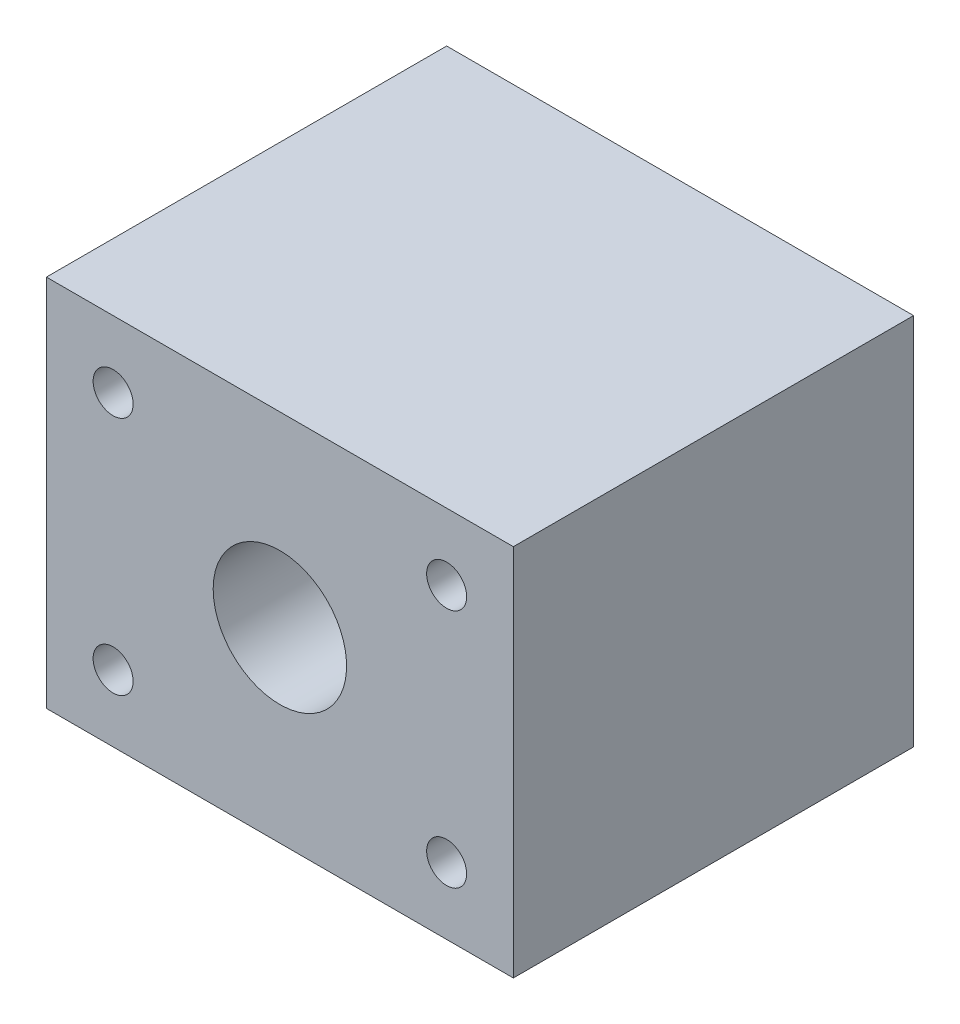
ISO-10303-21;
HEADER;
FILE_DESCRIPTION(('STEP AP214'),'2;1');
FILE_NAME('part.step','',(''),(''),'','','');
FILE_SCHEMA(('AUTOMOTIVE_DESIGN { 1 0 10303 214 1 1 1 1 }'));
ENDSEC;
DATA;
#1=APPLICATION_CONTEXT('core data for automotive mechanical design processes');
#2=APPLICATION_PROTOCOL_DEFINITION('international standard','automotive_design',2000,#1);
#3=PRODUCT_CONTEXT('',#1,'mechanical');
#4=PRODUCT('Part','Part','',(#3));
#5=PRODUCT_RELATED_PRODUCT_CATEGORY('part','',(#4));
#6=PRODUCT_DEFINITION_FORMATION('','',#4);
#7=PRODUCT_DEFINITION_CONTEXT('part definition',#1,'design');
#8=PRODUCT_DEFINITION('design','',#6,#7);
#9=PRODUCT_DEFINITION_SHAPE('','',#8);
#10=(LENGTH_UNIT() NAMED_UNIT(*) SI_UNIT(.MILLI.,.METRE.));
#11=(NAMED_UNIT(*) PLANE_ANGLE_UNIT() SI_UNIT($,.RADIAN.));
#12=(NAMED_UNIT(*) SI_UNIT($,.STERADIAN.) SOLID_ANGLE_UNIT());
#13=UNCERTAINTY_MEASURE_WITH_UNIT(LENGTH_MEASURE(1.E-05),#10,'distance_accuracy_value','');
#14=(GEOMETRIC_REPRESENTATION_CONTEXT(3) GLOBAL_UNCERTAINTY_ASSIGNED_CONTEXT((#13)) GLOBAL_UNIT_ASSIGNED_CONTEXT((#10,
#11,#12)) REPRESENTATION_CONTEXT('',''));
#15=CARTESIAN_POINT('',(0.,0.,0.));
#16=DIRECTION('',(0.,0.,1.));
#17=DIRECTION('',(1.,0.,0.));
#18=AXIS2_PLACEMENT_3D('',#15,#16,#17);
#19=CARTESIAN_POINT('',(17.5,28.,15.));
#20=DIRECTION('',(-1.,0.,0.));
#21=DIRECTION('',(0.,0.,1.));
#22=AXIS2_PLACEMENT_3D('',#19,#20,#21);
#23=PLANE('',#22);
#24=DIRECTION('',(0.,0.,-1.));
#25=VECTOR('',#24,1.);
#26=CARTESIAN_POINT('',(17.5,0.,15.));
#27=LINE('',#26,#25);
#28=CARTESIAN_POINT('',(17.5,0.,15.));
#29=VERTEX_POINT('',#28);
#30=CARTESIAN_POINT('',(17.5,0.,-15.));
#31=VERTEX_POINT('',#30);
#32=EDGE_CURVE('E107',#29,#31,#27,.T.);
#33=ORIENTED_EDGE('',*,*,#32,.T.);
#34=DIRECTION('',(0.,-1.,0.));
#35=VECTOR('',#34,1.);
#36=CARTESIAN_POINT('',(17.5,28.,-15.));
#37=LINE('',#36,#35);
#38=CARTESIAN_POINT('',(17.5,28.,-15.));
#39=VERTEX_POINT('',#38);
#40=EDGE_CURVE('E11',#39,#31,#37,.T.);
#41=ORIENTED_EDGE('',*,*,#40,.F.);
#42=DIRECTION('',(0.,0.,-1.));
#43=VECTOR('',#42,1.);
#44=CARTESIAN_POINT('',(17.5,28.,15.));
#45=LINE('',#44,#43);
#46=CARTESIAN_POINT('',(17.5,28.,15.));
#47=VERTEX_POINT('',#46);
#48=EDGE_CURVE('E91',#47,#39,#45,.T.);
#49=ORIENTED_EDGE('',*,*,#48,.F.);
#50=DIRECTION('',(0.,-1.,0.));
#51=VECTOR('',#50,1.);
#52=CARTESIAN_POINT('',(17.5,28.,15.));
#53=LINE('',#52,#51);
#54=EDGE_CURVE('E103',#47,#29,#53,.T.);
#55=ORIENTED_EDGE('',*,*,#54,.T.);
#56=EDGE_LOOP('',(#33,#41,#49,#55));
#57=FACE_BOUND('',#56,.T.);
#58=ADVANCED_FACE('F39',(#57),#23,.F.);
#59=CARTESIAN_POINT('',(-17.5,28.,-15.));
#60=DIRECTION('',(0.,0.,1.));
#61=DIRECTION('',(1.,0.,0.));
#62=AXIS2_PLACEMENT_3D('',#59,#60,#61);
#63=PLANE('',#62);
#64=CARTESIAN_POINT('',(0.,14.,-15.));
#65=DIRECTION('',(0.,0.,-1.));
#66=DIRECTION('',(-1.,0.,0.));
#67=AXIS2_PLACEMENT_3D('',#64,#65,#66);
#68=CIRCLE('',#67,11.);
#69=CARTESIAN_POINT('',(-11.,14.,-15.));
#70=VERTEX_POINT('',#69);
#71=EDGE_CURVE('E160',#70,#70,#68,.T.);
#72=ORIENTED_EDGE('',*,*,#71,.F.);
#73=EDGE_LOOP('',(#72));
#74=FACE_BOUND('',#73,.T.);
#75=DIRECTION('',(-1.,0.,0.));
#76=VECTOR('',#75,1.);
#77=CARTESIAN_POINT('',(-17.5,0.,-15.));
#78=LINE('',#77,#76);
#79=CARTESIAN_POINT('',(-17.5,0.,-15.));
#80=VERTEX_POINT('',#79);
#81=EDGE_CURVE('E96',#31,#80,#78,.T.);
#82=ORIENTED_EDGE('',*,*,#81,.T.);
#83=DIRECTION('',(0.,-1.,0.));
#84=VECTOR('',#83,1.);
#85=CARTESIAN_POINT('',(-17.5,28.,-15.));
#86=LINE('',#85,#84);
#87=CARTESIAN_POINT('',(-17.5,28.,-15.));
#88=VERTEX_POINT('',#87);
#89=EDGE_CURVE('E48',#88,#80,#86,.T.);
#90=ORIENTED_EDGE('',*,*,#89,.F.);
#91=DIRECTION('',(-1.,0.,0.));
#92=VECTOR('',#91,1.);
#93=CARTESIAN_POINT('',(-17.5,28.,-15.));
#94=LINE('',#93,#92);
#95=EDGE_CURVE('E86',#39,#88,#94,.T.);
#96=ORIENTED_EDGE('',*,*,#95,.F.);
#97=ORIENTED_EDGE('',*,*,#40,.T.);
#98=EDGE_LOOP('',(#82,#90,#96,#97));
#99=FACE_BOUND('',#98,.T.);
#100=ADVANCED_FACE('F95',(#74,#99),#63,.F.);
#101=CARTESIAN_POINT('',(-17.5,28.,15.));
#102=DIRECTION('',(1.,0.,0.));
#103=DIRECTION('',(0.,0.,-1.));
#104=AXIS2_PLACEMENT_3D('',#101,#102,#103);
#105=PLANE('',#104);
#106=DIRECTION('',(0.,0.,1.));
#107=VECTOR('',#106,1.);
#108=CARTESIAN_POINT('',(-17.5,0.,15.));
#109=LINE('',#108,#107);
#110=CARTESIAN_POINT('',(-17.5,0.,15.));
#111=VERTEX_POINT('',#110);
#112=EDGE_CURVE('E73',#80,#111,#109,.T.);
#113=ORIENTED_EDGE('',*,*,#112,.T.);
#114=DIRECTION('',(0.,-1.,0.));
#115=VECTOR('',#114,1.);
#116=CARTESIAN_POINT('',(-17.5,28.,15.));
#117=LINE('',#116,#115);
#118=CARTESIAN_POINT('',(-17.5,28.,15.));
#119=VERTEX_POINT('',#118);
#120=EDGE_CURVE('E98',#119,#111,#117,.T.);
#121=ORIENTED_EDGE('',*,*,#120,.F.);
#122=DIRECTION('',(0.,0.,1.));
#123=VECTOR('',#122,1.);
#124=CARTESIAN_POINT('',(-17.5,28.,15.));
#125=LINE('',#124,#123);
#126=EDGE_CURVE('E89',#88,#119,#125,.T.);
#127=ORIENTED_EDGE('',*,*,#126,.F.);
#128=ORIENTED_EDGE('',*,*,#89,.T.);
#129=EDGE_LOOP('',(#113,#121,#127,#128));
#130=FACE_BOUND('',#129,.T.);
#131=ADVANCED_FACE('F99',(#130),#105,.F.);
#132=CARTESIAN_POINT('',(-17.5,28.,15.));
#133=DIRECTION('',(0.,0.,-1.));
#134=DIRECTION('',(-1.,0.,0.));
#135=AXIS2_PLACEMENT_3D('',#132,#133,#134);
#136=PLANE('',#135);
#137=CARTESIAN_POINT('',(0.,14.,15.));
#138=DIRECTION('',(0.,0.,-1.));
#139=DIRECTION('',(-1.,0.,0.));
#140=AXIS2_PLACEMENT_3D('',#137,#138,#139);
#141=CIRCLE('',#140,5.);
#142=CARTESIAN_POINT('',(-5.,14.,15.));
#143=VERTEX_POINT('',#142);
#144=EDGE_CURVE('E164',#143,#143,#141,.T.);
#145=ORIENTED_EDGE('',*,*,#144,.T.);
#146=EDGE_LOOP('',(#145));
#147=FACE_BOUND('',#146,.T.);
#148=CARTESIAN_POINT('',(-12.5,5.,15.));
#149=DIRECTION('',(0.,0.,1.));
#150=DIRECTION('',(1.,0.,0.));
#151=AXIS2_PLACEMENT_3D('',#148,#149,#150);
#152=CIRCLE('',#151,1.5);
#153=CARTESIAN_POINT('',(-11.,5.,15.));
#154=VERTEX_POINT('',#153);
#155=EDGE_CURVE('E136',#154,#154,#152,.T.);
#156=ORIENTED_EDGE('',*,*,#155,.F.);
#157=EDGE_LOOP('',(#156));
#158=FACE_BOUND('',#157,.T.);
#159=CARTESIAN_POINT('',(12.5,5.,15.));
#160=DIRECTION('',(0.,0.,1.));
#161=DIRECTION('',(1.,0.,0.));
#162=AXIS2_PLACEMENT_3D('',#159,#160,#161);
#163=CIRCLE('',#162,1.5);
#164=CARTESIAN_POINT('',(14.,5.,15.));
#165=VERTEX_POINT('',#164);
#166=EDGE_CURVE('E145',#165,#165,#163,.T.);
#167=ORIENTED_EDGE('',*,*,#166,.F.);
#168=EDGE_LOOP('',(#167));
#169=FACE_BOUND('',#168,.T.);
#170=CARTESIAN_POINT('',(12.5,23.,15.));
#171=DIRECTION('',(0.,0.,1.));
#172=DIRECTION('',(1.,0.,0.));
#173=AXIS2_PLACEMENT_3D('',#170,#171,#172);
#174=CIRCLE('',#173,1.5);
#175=CARTESIAN_POINT('',(14.,23.,15.));
#176=VERTEX_POINT('',#175);
#177=EDGE_CURVE('E153',#176,#176,#174,.T.);
#178=ORIENTED_EDGE('',*,*,#177,.F.);
#179=EDGE_LOOP('',(#178));
#180=FACE_BOUND('',#179,.T.);
#181=CARTESIAN_POINT('',(-12.5,23.,15.));
#182=DIRECTION('',(0.,0.,1.));
#183=DIRECTION('',(1.,0.,0.));
#184=AXIS2_PLACEMENT_3D('',#181,#182,#183);
#185=CIRCLE('',#184,1.5);
#186=CARTESIAN_POINT('',(-11.,23.,15.));
#187=VERTEX_POINT('',#186);
#188=EDGE_CURVE('E128',#187,#187,#185,.T.);
#189=ORIENTED_EDGE('',*,*,#188,.F.);
#190=EDGE_LOOP('',(#189));
#191=FACE_BOUND('',#190,.T.);
#192=DIRECTION('',(1.,0.,0.));
#193=VECTOR('',#192,1.);
#194=CARTESIAN_POINT('',(-17.5,0.,15.));
#195=LINE('',#194,#193);
#196=EDGE_CURVE('E79',#111,#29,#195,.T.);
#197=ORIENTED_EDGE('',*,*,#196,.T.);
#198=ORIENTED_EDGE('',*,*,#54,.F.);
#199=DIRECTION('',(1.,0.,0.));
#200=VECTOR('',#199,1.);
#201=CARTESIAN_POINT('',(-17.5,28.,15.));
#202=LINE('',#201,#200);
#203=EDGE_CURVE('E56',#119,#47,#202,.T.);
#204=ORIENTED_EDGE('',*,*,#203,.F.);
#205=ORIENTED_EDGE('',*,*,#120,.T.);
#206=EDGE_LOOP('',(#197,#198,#204,#205));
#207=FACE_BOUND('',#206,.T.);
#208=ADVANCED_FACE('F121',(#147,#158,#169,#180,#191,#207),#136,.F.);
#209=CARTESIAN_POINT('',(0.,28.,0.));
#210=DIRECTION('',(0.,-1.,0.));
#211=DIRECTION('',(0.,0.,-1.));
#212=AXIS2_PLACEMENT_3D('',#209,#210,#211);
#213=PLANE('',#212);
#214=ORIENTED_EDGE('',*,*,#48,.T.);
#215=ORIENTED_EDGE('',*,*,#95,.T.);
#216=ORIENTED_EDGE('',*,*,#126,.T.);
#217=ORIENTED_EDGE('',*,*,#203,.T.);
#218=EDGE_LOOP('',(#214,#215,#216,#217));
#219=FACE_BOUND('',#218,.T.);
#220=ADVANCED_FACE('F87',(#219),#213,.F.);
#221=CARTESIAN_POINT('',(0.,0.,0.));
#222=DIRECTION('',(0.,-1.,0.));
#223=DIRECTION('',(0.,0.,-1.));
#224=AXIS2_PLACEMENT_3D('',#221,#222,#223);
#225=PLANE('',#224);
#226=ORIENTED_EDGE('',*,*,#32,.F.);
#227=ORIENTED_EDGE('',*,*,#196,.F.);
#228=ORIENTED_EDGE('',*,*,#112,.F.);
#229=ORIENTED_EDGE('',*,*,#81,.F.);
#230=EDGE_LOOP('',(#226,#227,#228,#229));
#231=FACE_BOUND('',#230,.T.);
#232=ADVANCED_FACE('F124',(#231),#225,.T.);
#233=CARTESIAN_POINT('',(-12.5,23.,5.));
#234=DIRECTION('',(0.,0.,1.));
#235=DIRECTION('',(1.,0.,0.));
#236=AXIS2_PLACEMENT_3D('',#233,#234,#235);
#237=CYLINDRICAL_SURFACE('',#236,1.5);
#238=CARTESIAN_POINT('',(-12.5,23.,5.));
#239=DIRECTION('',(0.,0.,1.));
#240=DIRECTION('',(1.,0.,0.));
#241=AXIS2_PLACEMENT_3D('',#238,#239,#240);
#242=CIRCLE('',#241,1.5);
#243=CARTESIAN_POINT('',(-11.,23.,5.));
#244=VERTEX_POINT('',#243);
#245=EDGE_CURVE('E111',#244,#244,#242,.T.);
#246=ORIENTED_EDGE('',*,*,#245,.F.);
#247=EDGE_LOOP('',(#246));
#248=FACE_BOUND('',#247,.T.);
#249=ORIENTED_EDGE('',*,*,#188,.T.);
#250=EDGE_LOOP('',(#249));
#251=FACE_BOUND('',#250,.T.);
#252=ADVANCED_FACE('F208',(#248,#251),#237,.F.);
#253=CARTESIAN_POINT('',(-12.5,23.,5.));
#254=DIRECTION('',(0.,0.,1.));
#255=DIRECTION('',(1.,0.,0.));
#256=AXIS2_PLACEMENT_3D('',#253,#254,#255);
#257=PLANE('',#256);
#258=ORIENTED_EDGE('',*,*,#245,.T.);
#259=EDGE_LOOP('',(#258));
#260=FACE_BOUND('',#259,.T.);
#261=ADVANCED_FACE('F213',(#260),#257,.T.);
#262=CARTESIAN_POINT('',(12.5,23.,5.));
#263=DIRECTION('',(0.,0.,1.));
#264=DIRECTION('',(1.,0.,0.));
#265=AXIS2_PLACEMENT_3D('',#262,#263,#264);
#266=CYLINDRICAL_SURFACE('',#265,1.5);
#267=CARTESIAN_POINT('',(12.5,23.,5.));
#268=DIRECTION('',(0.,0.,1.));
#269=DIRECTION('',(1.,0.,0.));
#270=AXIS2_PLACEMENT_3D('',#267,#268,#269);
#271=CIRCLE('',#270,1.5);
#272=CARTESIAN_POINT('',(14.,23.,5.));
#273=VERTEX_POINT('',#272);
#274=EDGE_CURVE('E132',#273,#273,#271,.T.);
#275=ORIENTED_EDGE('',*,*,#274,.F.);
#276=EDGE_LOOP('',(#275));
#277=FACE_BOUND('',#276,.T.);
#278=ORIENTED_EDGE('',*,*,#177,.T.);
#279=EDGE_LOOP('',(#278));
#280=FACE_BOUND('',#279,.T.);
#281=ADVANCED_FACE('F217',(#277,#280),#266,.F.);
#282=CARTESIAN_POINT('',(12.5,23.,5.));
#283=DIRECTION('',(0.,0.,1.));
#284=DIRECTION('',(1.,0.,0.));
#285=AXIS2_PLACEMENT_3D('',#282,#283,#284);
#286=PLANE('',#285);
#287=ORIENTED_EDGE('',*,*,#274,.T.);
#288=EDGE_LOOP('',(#287));
#289=FACE_BOUND('',#288,.T.);
#290=ADVANCED_FACE('F230',(#289),#286,.T.);
#291=CARTESIAN_POINT('',(12.5,5.,5.));
#292=DIRECTION('',(0.,0.,1.));
#293=DIRECTION('',(1.,0.,0.));
#294=AXIS2_PLACEMENT_3D('',#291,#292,#293);
#295=CYLINDRICAL_SURFACE('',#294,1.5);
#296=CARTESIAN_POINT('',(12.5,5.,5.));
#297=DIRECTION('',(0.,0.,1.));
#298=DIRECTION('',(1.,0.,0.));
#299=AXIS2_PLACEMENT_3D('',#296,#297,#298);
#300=CIRCLE('',#299,1.5);
#301=CARTESIAN_POINT('',(14.,5.,5.));
#302=VERTEX_POINT('',#301);
#303=EDGE_CURVE('E149',#302,#302,#300,.T.);
#304=ORIENTED_EDGE('',*,*,#303,.F.);
#305=EDGE_LOOP('',(#304));
#306=FACE_BOUND('',#305,.T.);
#307=ORIENTED_EDGE('',*,*,#166,.T.);
#308=EDGE_LOOP('',(#307));
#309=FACE_BOUND('',#308,.T.);
#310=ADVANCED_FACE('F227',(#306,#309),#295,.F.);
#311=CARTESIAN_POINT('',(12.5,5.,5.));
#312=DIRECTION('',(0.,0.,1.));
#313=DIRECTION('',(1.,0.,0.));
#314=AXIS2_PLACEMENT_3D('',#311,#312,#313);
#315=PLANE('',#314);
#316=ORIENTED_EDGE('',*,*,#303,.T.);
#317=EDGE_LOOP('',(#316));
#318=FACE_BOUND('',#317,.T.);
#319=ADVANCED_FACE('F222',(#318),#315,.T.);
#320=CARTESIAN_POINT('',(-12.5,5.,5.));
#321=DIRECTION('',(0.,0.,1.));
#322=DIRECTION('',(1.,0.,0.));
#323=AXIS2_PLACEMENT_3D('',#320,#321,#322);
#324=CYLINDRICAL_SURFACE('',#323,1.5);
#325=CARTESIAN_POINT('',(-12.5,5.,5.));
#326=DIRECTION('',(0.,0.,1.));
#327=DIRECTION('',(1.,0.,0.));
#328=AXIS2_PLACEMENT_3D('',#325,#326,#327);
#329=CIRCLE('',#328,1.5);
#330=CARTESIAN_POINT('',(-11.,5.,5.));
#331=VERTEX_POINT('',#330);
#332=EDGE_CURVE('E140',#331,#331,#329,.T.);
#333=ORIENTED_EDGE('',*,*,#332,.F.);
#334=EDGE_LOOP('',(#333));
#335=FACE_BOUND('',#334,.T.);
#336=ORIENTED_EDGE('',*,*,#155,.T.);
#337=EDGE_LOOP('',(#336));
#338=FACE_BOUND('',#337,.T.);
#339=ADVANCED_FACE('F219',(#335,#338),#324,.F.);
#340=CARTESIAN_POINT('',(-12.5,5.,5.));
#341=DIRECTION('',(0.,0.,1.));
#342=DIRECTION('',(1.,0.,0.));
#343=AXIS2_PLACEMENT_3D('',#340,#341,#342);
#344=PLANE('',#343);
#345=ORIENTED_EDGE('',*,*,#332,.T.);
#346=EDGE_LOOP('',(#345));
#347=FACE_BOUND('',#346,.T.);
#348=ADVANCED_FACE('F193',(#347),#344,.T.);
#349=CARTESIAN_POINT('',(0.,14.,-10.));
#350=DIRECTION('',(0.,0.,-1.));
#351=DIRECTION('',(-1.,0.,0.));
#352=AXIS2_PLACEMENT_3D('',#349,#350,#351);
#353=CYLINDRICAL_SURFACE('',#352,11.);
#354=CARTESIAN_POINT('',(0.,14.,-10.));
#355=DIRECTION('',(0.,0.,-1.));
#356=DIRECTION('',(-1.,0.,0.));
#357=AXIS2_PLACEMENT_3D('',#354,#355,#356);
#358=CIRCLE('',#357,11.);
#359=CARTESIAN_POINT('',(-11.,14.,-10.));
#360=VERTEX_POINT('',#359);
#361=EDGE_CURVE('E141',#360,#360,#358,.T.);
#362=ORIENTED_EDGE('',*,*,#361,.F.);
#363=EDGE_LOOP('',(#362));
#364=FACE_BOUND('',#363,.T.);
#365=ORIENTED_EDGE('',*,*,#71,.T.);
#366=EDGE_LOOP('',(#365));
#367=FACE_BOUND('',#366,.T.);
#368=ADVANCED_FACE('F187',(#364,#367),#353,.F.);
#369=CARTESIAN_POINT('',(0.,14.,-10.));
#370=DIRECTION('',(0.,0.,-1.));
#371=DIRECTION('',(-1.,0.,0.));
#372=AXIS2_PLACEMENT_3D('',#369,#370,#371);
#373=PLANE('',#372);
#374=CARTESIAN_POINT('',(0.,14.,-10.));
#375=DIRECTION('',(0.,0.,-1.));
#376=DIRECTION('',(-1.,0.,0.));
#377=AXIS2_PLACEMENT_3D('',#374,#375,#376);
#378=CIRCLE('',#377,5.);
#379=CARTESIAN_POINT('',(-5.,14.,-10.));
#380=VERTEX_POINT('',#379);
#381=EDGE_CURVE('E168',#380,#380,#378,.T.);
#382=ORIENTED_EDGE('',*,*,#381,.F.);
#383=EDGE_LOOP('',(#382));
#384=FACE_BOUND('',#383,.T.);
#385=ORIENTED_EDGE('',*,*,#361,.T.);
#386=EDGE_LOOP('',(#385));
#387=FACE_BOUND('',#386,.T.);
#388=ADVANCED_FACE('F181',(#384,#387),#373,.T.);
#389=CARTESIAN_POINT('',(0.,14.,15.));
#390=DIRECTION('',(0.,0.,-1.));
#391=DIRECTION('',(-1.,0.,0.));
#392=AXIS2_PLACEMENT_3D('',#389,#390,#391);
#393=CYLINDRICAL_SURFACE('',#392,5.);
#394=ORIENTED_EDGE('',*,*,#144,.F.);
#395=EDGE_LOOP('',(#394));
#396=FACE_BOUND('',#395,.T.);
#397=ORIENTED_EDGE('',*,*,#381,.T.);
#398=EDGE_LOOP('',(#397));
#399=FACE_BOUND('',#398,.T.);
#400=ADVANCED_FACE('F178',(#396,#399),#393,.F.);
#401=CLOSED_SHELL('',(#58,#100,#131,#208,#220,#232,#252,#261,#281,#290,#310,#319,#339,#348,#368,
#388,#400));
#402=MANIFOLD_SOLID_BREP('B2',#401);
#403=ADVANCED_BREP_SHAPE_REPRESENTATION('',(#18,#402),#14);
#404=SHAPE_DEFINITION_REPRESENTATION(#9,#403);
ENDSEC;
END-ISO-10303-21;
